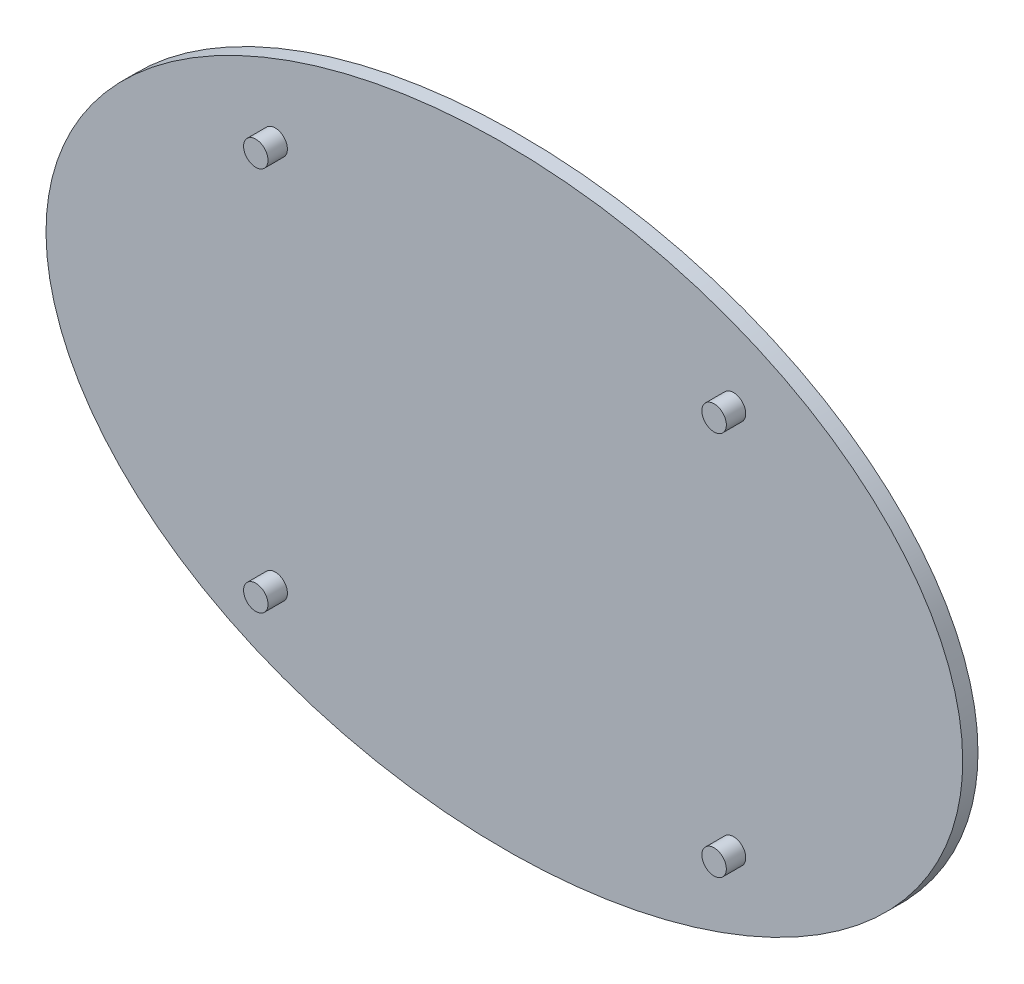
ISO-10303-21;
HEADER;
FILE_DESCRIPTION(('STEP AP214'),'2;1');
FILE_NAME('part.step','',(''),(''),'','','');
FILE_SCHEMA(('AUTOMOTIVE_DESIGN { 1 0 10303 214 1 1 1 1 }'));
ENDSEC;
DATA;
#1=APPLICATION_CONTEXT('core data for automotive mechanical design processes');
#2=APPLICATION_PROTOCOL_DEFINITION('international standard','automotive_design',2000,#1);
#3=PRODUCT_CONTEXT('',#1,'mechanical');
#4=PRODUCT('Part','Part','',(#3));
#5=PRODUCT_RELATED_PRODUCT_CATEGORY('part','',(#4));
#6=PRODUCT_DEFINITION_FORMATION('','',#4);
#7=PRODUCT_DEFINITION_CONTEXT('part definition',#1,'design');
#8=PRODUCT_DEFINITION('design','',#6,#7);
#9=PRODUCT_DEFINITION_SHAPE('','',#8);
#10=(LENGTH_UNIT() NAMED_UNIT(*) SI_UNIT(.MILLI.,.METRE.));
#11=(NAMED_UNIT(*) PLANE_ANGLE_UNIT() SI_UNIT($,.RADIAN.));
#12=(NAMED_UNIT(*) SI_UNIT($,.STERADIAN.) SOLID_ANGLE_UNIT());
#13=UNCERTAINTY_MEASURE_WITH_UNIT(LENGTH_MEASURE(1.E-05),#10,'distance_accuracy_value','');
#14=(GEOMETRIC_REPRESENTATION_CONTEXT(3) GLOBAL_UNCERTAINTY_ASSIGNED_CONTEXT((#13)) GLOBAL_UNIT_ASSIGNED_CONTEXT((#10,
#11,#12)) REPRESENTATION_CONTEXT('',''));
#15=CARTESIAN_POINT('',(0.,0.,0.));
#16=DIRECTION('',(0.,0.,1.));
#17=DIRECTION('',(1.,0.,0.));
#18=AXIS2_PLACEMENT_3D('',#15,#16,#17);
#19=CARTESIAN_POINT('',(0.,0.,0.));
#20=DIRECTION('',(0.,0.,1.));
#21=DIRECTION('',(1.,0.,0.));
#22=AXIS2_PLACEMENT_3D('',#19,#20,#21);
#23=ELLIPSE('',#22,150.,100.);
#24=DIRECTION('',(0.,0.,1.));
#25=VECTOR('',#24,1.);
#26=SURFACE_OF_LINEAR_EXTRUSION('',#23,#25);
#27=CARTESIAN_POINT('',(150.,0.,0.));
#28=VERTEX_POINT('',#27);
#29=EDGE_CURVE('E10',#28,#28,#23,.T.);
#30=ORIENTED_EDGE('',*,*,#29,.T.);
#31=EDGE_LOOP('',(#30));
#32=FACE_BOUND('',#31,.T.);
#33=CARTESIAN_POINT('',(0.,0.,5.));
#34=DIRECTION('',(0.,0.,1.));
#35=DIRECTION('',(1.,0.,0.));
#36=AXIS2_PLACEMENT_3D('',#33,#34,#35);
#37=ELLIPSE('',#36,150.,100.);
#38=CARTESIAN_POINT('',(150.,0.,5.));
#39=VERTEX_POINT('',#38);
#40=EDGE_CURVE('E35',#39,#39,#37,.T.);
#41=ORIENTED_EDGE('',*,*,#40,.F.);
#42=EDGE_LOOP('',(#41));
#43=FACE_BOUND('',#42,.T.);
#44=ADVANCED_FACE('F31',(#32,#43),#26,.T.);
#45=CARTESIAN_POINT('',(0.,0.,0.));
#46=DIRECTION('',(0.,0.,1.));
#47=DIRECTION('',(1.,0.,0.));
#48=AXIS2_PLACEMENT_3D('',#45,#46,#47);
#49=PLANE('',#48);
#50=ORIENTED_EDGE('',*,*,#29,.F.);
#51=EDGE_LOOP('',(#50));
#52=FACE_BOUND('',#51,.T.);
#53=ADVANCED_FACE('F81',(#52),#49,.F.);
#54=CARTESIAN_POINT('',(0.,0.,5.));
#55=DIRECTION('',(0.,0.,1.));
#56=DIRECTION('',(1.,0.,0.));
#57=AXIS2_PLACEMENT_3D('',#54,#55,#56);
#58=PLANE('',#57);
#59=CARTESIAN_POINT('',(74.9930539598718,-62.9266439185867,5.));
#60=DIRECTION('',(0.,0.,1.));
#61=DIRECTION('',(-1.,0.,0.));
#62=AXIS2_PLACEMENT_3D('',#59,#60,#61);
#63=CIRCLE('',#62,3.99999999999999);
#64=CARTESIAN_POINT('',(70.9930539598718,-62.9266439185867,5.));
#65=VERTEX_POINT('',#64);
#66=EDGE_CURVE('E62',#65,#65,#63,.T.);
#67=ORIENTED_EDGE('',*,*,#66,.F.);
#68=EDGE_LOOP('',(#67));
#69=FACE_BOUND('',#68,.T.);
#70=CARTESIAN_POINT('',(74.9930539598718,62.9266439185867,5.));
#71=DIRECTION('',(0.,0.,1.));
#72=DIRECTION('',(1.,0.,0.));
#73=AXIS2_PLACEMENT_3D('',#70,#71,#72);
#74=CIRCLE('',#73,3.99999999999999);
#75=CARTESIAN_POINT('',(78.9930539598718,62.9266439185867,5.));
#76=VERTEX_POINT('',#75);
#77=EDGE_CURVE('E56',#76,#76,#74,.T.);
#78=ORIENTED_EDGE('',*,*,#77,.F.);
#79=EDGE_LOOP('',(#78));
#80=FACE_BOUND('',#79,.T.);
#81=CARTESIAN_POINT('',(-74.9930539598718,62.9266439185867,5.));
#82=DIRECTION('',(0.,0.,1.));
#83=DIRECTION('',(-1.,0.,0.));
#84=AXIS2_PLACEMENT_3D('',#81,#82,#83);
#85=CIRCLE('',#84,3.99999999999999);
#86=CARTESIAN_POINT('',(-78.9930539598718,62.9266439185867,5.));
#87=VERTEX_POINT('',#86);
#88=EDGE_CURVE('E50',#87,#87,#85,.T.);
#89=ORIENTED_EDGE('',*,*,#88,.F.);
#90=EDGE_LOOP('',(#89));
#91=FACE_BOUND('',#90,.T.);
#92=CARTESIAN_POINT('',(-74.9930539598718,-62.9266439185867,5.));
#93=DIRECTION('',(0.,0.,1.));
#94=DIRECTION('',(1.,0.,0.));
#95=AXIS2_PLACEMENT_3D('',#92,#93,#94);
#96=CIRCLE('',#95,3.99999999999999);
#97=CARTESIAN_POINT('',(-70.9930539598718,-62.9266439185867,5.));
#98=VERTEX_POINT('',#97);
#99=EDGE_CURVE('E44',#98,#98,#96,.T.);
#100=ORIENTED_EDGE('',*,*,#99,.F.);
#101=EDGE_LOOP('',(#100));
#102=FACE_BOUND('',#101,.T.);
#103=ORIENTED_EDGE('',*,*,#40,.T.);
#104=EDGE_LOOP('',(#103));
#105=FACE_BOUND('',#104,.T.);
#106=ADVANCED_FACE('F77',(#69,#80,#91,#102,#105),#58,.T.);
#107=CARTESIAN_POINT('',(-74.9930539598718,-62.9266439185867,11.35));
#108=DIRECTION('',(0.,0.,-1.));
#109=DIRECTION('',(-1.,0.,0.));
#110=AXIS2_PLACEMENT_3D('',#107,#108,#109);
#111=CYLINDRICAL_SURFACE('',#110,3.99999999999999);
#112=CARTESIAN_POINT('',(-74.9930539598718,-62.9266439185867,11.35));
#113=DIRECTION('',(0.,0.,1.));
#114=DIRECTION('',(1.,0.,0.));
#115=AXIS2_PLACEMENT_3D('',#112,#113,#114);
#116=CIRCLE('',#115,3.99999999999999);
#117=CARTESIAN_POINT('',(-70.9930539598718,-62.9266439185867,11.35));
#118=VERTEX_POINT('',#117);
#119=EDGE_CURVE('E41',#118,#118,#116,.T.);
#120=ORIENTED_EDGE('',*,*,#119,.F.);
#121=EDGE_LOOP('',(#120));
#122=FACE_BOUND('',#121,.T.);
#123=ORIENTED_EDGE('',*,*,#99,.T.);
#124=EDGE_LOOP('',(#123));
#125=FACE_BOUND('',#124,.T.);
#126=ADVANCED_FACE('F80',(#122,#125),#111,.T.);
#127=CARTESIAN_POINT('',(-74.9930539598718,-62.9266439185867,11.35));
#128=DIRECTION('',(0.,0.,1.));
#129=DIRECTION('',(1.,0.,0.));
#130=AXIS2_PLACEMENT_3D('',#127,#128,#129);
#131=PLANE('',#130);
#132=ORIENTED_EDGE('',*,*,#119,.T.);
#133=EDGE_LOOP('',(#132));
#134=FACE_BOUND('',#133,.T.);
#135=ADVANCED_FACE('F101',(#134),#131,.T.);
#136=CARTESIAN_POINT('',(-74.9930539598718,62.9266439185867,11.35));
#137=DIRECTION('',(0.,0.,-1.));
#138=DIRECTION('',(-1.,0.,0.));
#139=AXIS2_PLACEMENT_3D('',#136,#137,#138);
#140=CYLINDRICAL_SURFACE('',#139,3.99999999999999);
#141=CARTESIAN_POINT('',(-74.9930539598718,62.9266439185867,11.35));
#142=DIRECTION('',(0.,0.,1.));
#143=DIRECTION('',(-1.,0.,0.));
#144=AXIS2_PLACEMENT_3D('',#141,#142,#143);
#145=CIRCLE('',#144,3.99999999999999);
#146=CARTESIAN_POINT('',(-78.9930539598718,62.9266439185867,11.35));
#147=VERTEX_POINT('',#146);
#148=EDGE_CURVE('E47',#147,#147,#145,.T.);
#149=ORIENTED_EDGE('',*,*,#148,.F.);
#150=EDGE_LOOP('',(#149));
#151=FACE_BOUND('',#150,.T.);
#152=ORIENTED_EDGE('',*,*,#88,.T.);
#153=EDGE_LOOP('',(#152));
#154=FACE_BOUND('',#153,.T.);
#155=ADVANCED_FACE('F105',(#151,#154),#140,.T.);
#156=CARTESIAN_POINT('',(-74.9930539598718,62.9266439185867,11.35));
#157=DIRECTION('',(0.,0.,-1.));
#158=DIRECTION('',(-1.,0.,0.));
#159=AXIS2_PLACEMENT_3D('',#156,#157,#158);
#160=PLANE('',#159);
#161=ORIENTED_EDGE('',*,*,#148,.T.);
#162=EDGE_LOOP('',(#161));
#163=FACE_BOUND('',#162,.T.);
#164=ADVANCED_FACE('F109',(#163),#160,.F.);
#165=CARTESIAN_POINT('',(74.9930539598718,62.9266439185867,11.35));
#166=DIRECTION('',(0.,0.,-1.));
#167=DIRECTION('',(-1.,0.,0.));
#168=AXIS2_PLACEMENT_3D('',#165,#166,#167);
#169=CYLINDRICAL_SURFACE('',#168,3.99999999999999);
#170=CARTESIAN_POINT('',(74.9930539598718,62.9266439185867,11.35));
#171=DIRECTION('',(0.,0.,1.));
#172=DIRECTION('',(1.,0.,0.));
#173=AXIS2_PLACEMENT_3D('',#170,#171,#172);
#174=CIRCLE('',#173,3.99999999999999);
#175=CARTESIAN_POINT('',(78.9930539598718,62.9266439185867,11.35));
#176=VERTEX_POINT('',#175);
#177=EDGE_CURVE('E53',#176,#176,#174,.T.);
#178=ORIENTED_EDGE('',*,*,#177,.F.);
#179=EDGE_LOOP('',(#178));
#180=FACE_BOUND('',#179,.T.);
#181=ORIENTED_EDGE('',*,*,#77,.T.);
#182=EDGE_LOOP('',(#181));
#183=FACE_BOUND('',#182,.T.);
#184=ADVANCED_FACE('F113',(#180,#183),#169,.T.);
#185=CARTESIAN_POINT('',(74.9930539598718,62.9266439185867,11.35));
#186=DIRECTION('',(0.,0.,1.));
#187=DIRECTION('',(1.,0.,0.));
#188=AXIS2_PLACEMENT_3D('',#185,#186,#187);
#189=PLANE('',#188);
#190=ORIENTED_EDGE('',*,*,#177,.T.);
#191=EDGE_LOOP('',(#190));
#192=FACE_BOUND('',#191,.T.);
#193=ADVANCED_FACE('F73',(#192),#189,.T.);
#194=CARTESIAN_POINT('',(74.9930539598718,-62.9266439185867,11.35));
#195=DIRECTION('',(0.,0.,-1.));
#196=DIRECTION('',(-1.,0.,0.));
#197=AXIS2_PLACEMENT_3D('',#194,#195,#196);
#198=CYLINDRICAL_SURFACE('',#197,3.99999999999999);
#199=CARTESIAN_POINT('',(74.9930539598718,-62.9266439185867,11.35));
#200=DIRECTION('',(0.,0.,1.));
#201=DIRECTION('',(-1.,0.,0.));
#202=AXIS2_PLACEMENT_3D('',#199,#200,#201);
#203=CIRCLE('',#202,3.99999999999999);
#204=CARTESIAN_POINT('',(70.9930539598718,-62.9266439185867,11.35));
#205=VERTEX_POINT('',#204);
#206=EDGE_CURVE('E59',#205,#205,#203,.T.);
#207=ORIENTED_EDGE('',*,*,#206,.F.);
#208=EDGE_LOOP('',(#207));
#209=FACE_BOUND('',#208,.T.);
#210=ORIENTED_EDGE('',*,*,#66,.T.);
#211=EDGE_LOOP('',(#210));
#212=FACE_BOUND('',#211,.T.);
#213=ADVANCED_FACE('F70',(#209,#212),#198,.T.);
#214=CARTESIAN_POINT('',(74.9930539598718,-62.9266439185867,11.35));
#215=DIRECTION('',(0.,0.,-1.));
#216=DIRECTION('',(-1.,0.,0.));
#217=AXIS2_PLACEMENT_3D('',#214,#215,#216);
#218=PLANE('',#217);
#219=ORIENTED_EDGE('',*,*,#206,.T.);
#220=EDGE_LOOP('',(#219));
#221=FACE_BOUND('',#220,.T.);
#222=ADVANCED_FACE('F68',(#221),#218,.F.);
#223=CLOSED_SHELL('',(#44,#53,#106,#126,#135,#155,#164,#184,#193,#213,#222));
#224=MANIFOLD_SOLID_BREP('B2',#223);
#225=ADVANCED_BREP_SHAPE_REPRESENTATION('',(#18,#224),#14);
#226=SHAPE_DEFINITION_REPRESENTATION(#9,#225);
ENDSEC;
END-ISO-10303-21;
